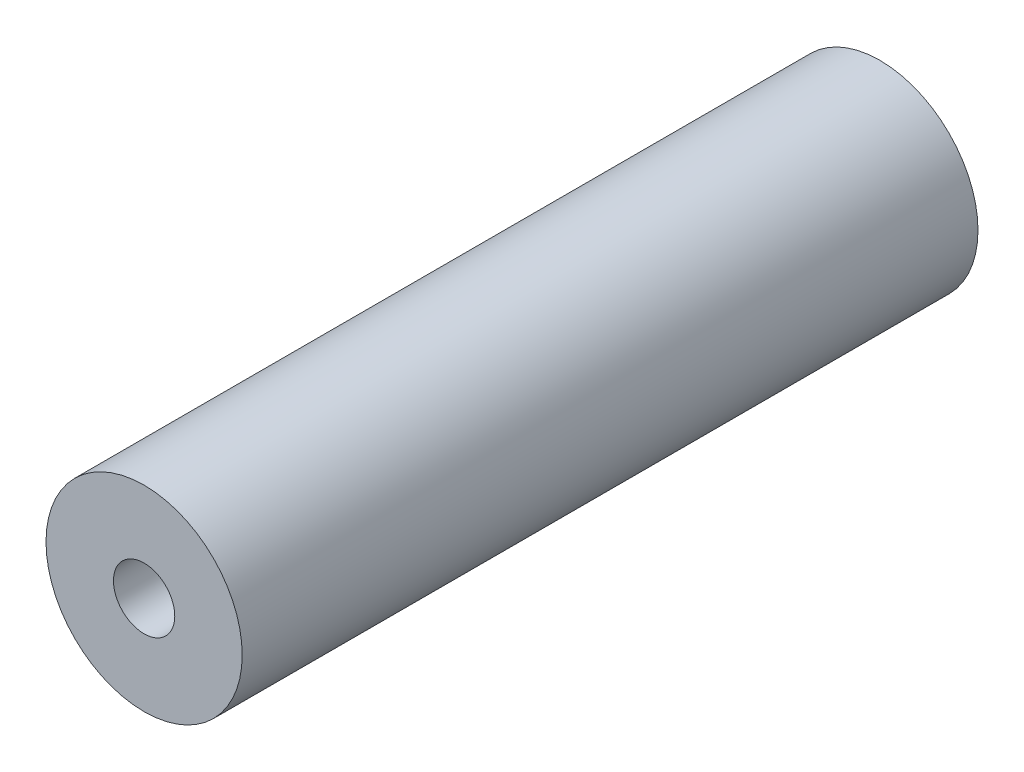
ISO-10303-21;
HEADER;
FILE_DESCRIPTION(('STEP AP214'),'2;1');
FILE_NAME('part.step','',(''),(''),'','','');
FILE_SCHEMA(('AUTOMOTIVE_DESIGN { 1 0 10303 214 1 1 1 1 }'));
ENDSEC;
DATA;
#1=APPLICATION_CONTEXT('core data for automotive mechanical design processes');
#2=APPLICATION_PROTOCOL_DEFINITION('international standard','automotive_design',2000,#1);
#3=PRODUCT_CONTEXT('',#1,'mechanical');
#4=PRODUCT('Part','Part','',(#3));
#5=PRODUCT_RELATED_PRODUCT_CATEGORY('part','',(#4));
#6=PRODUCT_DEFINITION_FORMATION('','',#4);
#7=PRODUCT_DEFINITION_CONTEXT('part definition',#1,'design');
#8=PRODUCT_DEFINITION('design','',#6,#7);
#9=PRODUCT_DEFINITION_SHAPE('','',#8);
#10=(LENGTH_UNIT() NAMED_UNIT(*) SI_UNIT(.MILLI.,.METRE.));
#11=(NAMED_UNIT(*) PLANE_ANGLE_UNIT() SI_UNIT($,.RADIAN.));
#12=(NAMED_UNIT(*) SI_UNIT($,.STERADIAN.) SOLID_ANGLE_UNIT());
#13=UNCERTAINTY_MEASURE_WITH_UNIT(LENGTH_MEASURE(1.E-05),#10,'distance_accuracy_value','');
#14=(GEOMETRIC_REPRESENTATION_CONTEXT(3) GLOBAL_UNCERTAINTY_ASSIGNED_CONTEXT((#13)) GLOBAL_UNIT_ASSIGNED_CONTEXT((#10,
#11,#12)) REPRESENTATION_CONTEXT('',''));
#15=CARTESIAN_POINT('',(0.,0.,0.));
#16=DIRECTION('',(0.,0.,1.));
#17=DIRECTION('',(1.,0.,0.));
#18=AXIS2_PLACEMENT_3D('',#15,#16,#17);
#19=CARTESIAN_POINT('',(0.,0.,15.));
#20=DIRECTION('',(0.,0.,-1.));
#21=DIRECTION('',(-1.,0.,0.));
#22=AXIS2_PLACEMENT_3D('',#19,#20,#21);
#23=CYLINDRICAL_SURFACE('',#22,4.);
#24=CARTESIAN_POINT('',(0.,0.,15.));
#25=DIRECTION('',(0.,0.,1.));
#26=DIRECTION('',(1.,0.,0.));
#27=AXIS2_PLACEMENT_3D('',#24,#25,#26);
#28=CIRCLE('',#27,4.);
#29=CARTESIAN_POINT('',(4.,0.,15.));
#30=VERTEX_POINT('',#29);
#31=EDGE_CURVE('E11',#30,#30,#28,.T.);
#32=ORIENTED_EDGE('',*,*,#31,.F.);
#33=EDGE_LOOP('',(#32));
#34=FACE_BOUND('',#33,.T.);
#35=CARTESIAN_POINT('',(0.,0.,-15.));
#36=DIRECTION('',(0.,0.,1.));
#37=DIRECTION('',(1.,0.,0.));
#38=AXIS2_PLACEMENT_3D('',#35,#36,#37);
#39=CIRCLE('',#38,4.);
#40=CARTESIAN_POINT('',(4.,0.,-15.));
#41=VERTEX_POINT('',#40);
#42=EDGE_CURVE('E49',#41,#41,#39,.T.);
#43=ORIENTED_EDGE('',*,*,#42,.T.);
#44=EDGE_LOOP('',(#43));
#45=FACE_BOUND('',#44,.T.);
#46=ADVANCED_FACE('F46',(#34,#45),#23,.T.);
#47=CARTESIAN_POINT('',(0.,0.,15.));
#48=DIRECTION('',(0.,0.,1.));
#49=DIRECTION('',(1.,0.,0.));
#50=AXIS2_PLACEMENT_3D('',#47,#48,#49);
#51=PLANE('',#50);
#52=CARTESIAN_POINT('',(0.,0.,15.));
#53=DIRECTION('',(0.,0.,1.));
#54=DIRECTION('',(1.,0.,0.));
#55=AXIS2_PLACEMENT_3D('',#52,#53,#54);
#56=CIRCLE('',#55,1.25);
#57=CARTESIAN_POINT('',(1.25,0.,15.));
#58=VERTEX_POINT('',#57);
#59=EDGE_CURVE('E69',#58,#58,#56,.T.);
#60=ORIENTED_EDGE('',*,*,#59,.F.);
#61=EDGE_LOOP('',(#60));
#62=FACE_BOUND('',#61,.T.);
#63=ORIENTED_EDGE('',*,*,#31,.T.);
#64=EDGE_LOOP('',(#63));
#65=FACE_BOUND('',#64,.T.);
#66=ADVANCED_FACE('F88',(#62,#65),#51,.T.);
#67=CARTESIAN_POINT('',(0.,0.,-15.));
#68=DIRECTION('',(0.,0.,1.));
#69=DIRECTION('',(1.,0.,0.));
#70=AXIS2_PLACEMENT_3D('',#67,#68,#69);
#71=PLANE('',#70);
#72=CARTESIAN_POINT('',(0.,0.,-15.));
#73=DIRECTION('',(0.,0.,-1.));
#74=DIRECTION('',(-1.,0.,0.));
#75=AXIS2_PLACEMENT_3D('',#72,#73,#74);
#76=CIRCLE('',#75,1.25);
#77=CARTESIAN_POINT('',(-1.25,0.,-15.));
#78=VERTEX_POINT('',#77);
#79=EDGE_CURVE('E70',#78,#78,#76,.T.);
#80=ORIENTED_EDGE('',*,*,#79,.F.);
#81=EDGE_LOOP('',(#80));
#82=FACE_BOUND('',#81,.T.);
#83=ORIENTED_EDGE('',*,*,#42,.F.);
#84=EDGE_LOOP('',(#83));
#85=FACE_BOUND('',#84,.T.);
#86=ADVANCED_FACE('F85',(#82,#85),#71,.F.);
#87=CARTESIAN_POINT('',(0.,0.,7.5));
#88=DIRECTION('',(0.,0.,1.));
#89=DIRECTION('',(1.,0.,0.));
#90=AXIS2_PLACEMENT_3D('',#87,#88,#89);
#91=CONICAL_SURFACE('',#90,1.25,1.02974425867665);
#92=CARTESIAN_POINT('',(0.,0.,6.74892422621555));
#93=VERTEX_POINT('',#92);
#94=VERTEX_LOOP('',#93);
#95=FACE_BOUND('',#94,.T.);
#96=CARTESIAN_POINT('',(0.,0.,7.5));
#97=DIRECTION('',(0.,0.,1.));
#98=DIRECTION('',(1.,0.,0.));
#99=AXIS2_PLACEMENT_3D('',#96,#97,#98);
#100=CIRCLE('',#99,1.25);
#101=CARTESIAN_POINT('',(1.25,0.,7.5));
#102=VERTEX_POINT('',#101);
#103=EDGE_CURVE('E73',#102,#102,#100,.T.);
#104=ORIENTED_EDGE('',*,*,#103,.T.);
#105=EDGE_LOOP('',(#104));
#106=FACE_BOUND('',#105,.T.);
#107=ADVANCED_FACE('F87',(#95,#106),#91,.F.);
#108=CARTESIAN_POINT('',(0.,0.,15.));
#109=DIRECTION('',(0.,0.,1.));
#110=DIRECTION('',(1.,0.,0.));
#111=AXIS2_PLACEMENT_3D('',#108,#109,#110);
#112=CYLINDRICAL_SURFACE('',#111,1.25);
#113=ORIENTED_EDGE('',*,*,#103,.F.);
#114=EDGE_LOOP('',(#113));
#115=FACE_BOUND('',#114,.T.);
#116=ORIENTED_EDGE('',*,*,#59,.T.);
#117=EDGE_LOOP('',(#116));
#118=FACE_BOUND('',#117,.T.);
#119=ADVANCED_FACE('F63',(#115,#118),#112,.F.);
#120=CARTESIAN_POINT('',(0.,0.,-7.5));
#121=DIRECTION('',(0.,0.,-1.));
#122=DIRECTION('',(-1.,0.,0.));
#123=AXIS2_PLACEMENT_3D('',#120,#121,#122);
#124=CONICAL_SURFACE('',#123,1.25,1.02974425867665);
#125=CARTESIAN_POINT('',(0.,0.,-6.74892422621555));
#126=VERTEX_POINT('',#125);
#127=VERTEX_LOOP('',#126);
#128=FACE_BOUND('',#127,.T.);
#129=CARTESIAN_POINT('',(0.,0.,-7.5));
#130=DIRECTION('',(0.,0.,-1.));
#131=DIRECTION('',(-1.,0.,0.));
#132=AXIS2_PLACEMENT_3D('',#129,#130,#131);
#133=CIRCLE('',#132,1.25);
#134=CARTESIAN_POINT('',(-1.25,0.,-7.5));
#135=VERTEX_POINT('',#134);
#136=EDGE_CURVE('E67',#135,#135,#133,.T.);
#137=ORIENTED_EDGE('',*,*,#136,.T.);
#138=EDGE_LOOP('',(#137));
#139=FACE_BOUND('',#138,.T.);
#140=ADVANCED_FACE('F59',(#128,#139),#124,.F.);
#141=CARTESIAN_POINT('',(0.,0.,-15.));
#142=DIRECTION('',(0.,0.,-1.));
#143=DIRECTION('',(-1.,0.,0.));
#144=AXIS2_PLACEMENT_3D('',#141,#142,#143);
#145=CYLINDRICAL_SURFACE('',#144,1.25);
#146=ORIENTED_EDGE('',*,*,#136,.F.);
#147=EDGE_LOOP('',(#146));
#148=FACE_BOUND('',#147,.T.);
#149=ORIENTED_EDGE('',*,*,#79,.T.);
#150=EDGE_LOOP('',(#149));
#151=FACE_BOUND('',#150,.T.);
#152=ADVANCED_FACE('F62',(#148,#151),#145,.F.);
#153=CLOSED_SHELL('',(#46,#66,#86,#107,#119,#140,#152));
#154=MANIFOLD_SOLID_BREP('B2',#153);
#155=ADVANCED_BREP_SHAPE_REPRESENTATION('',(#18,#154),#14);
#156=SHAPE_DEFINITION_REPRESENTATION(#9,#155);
ENDSEC;
END-ISO-10303-21;
